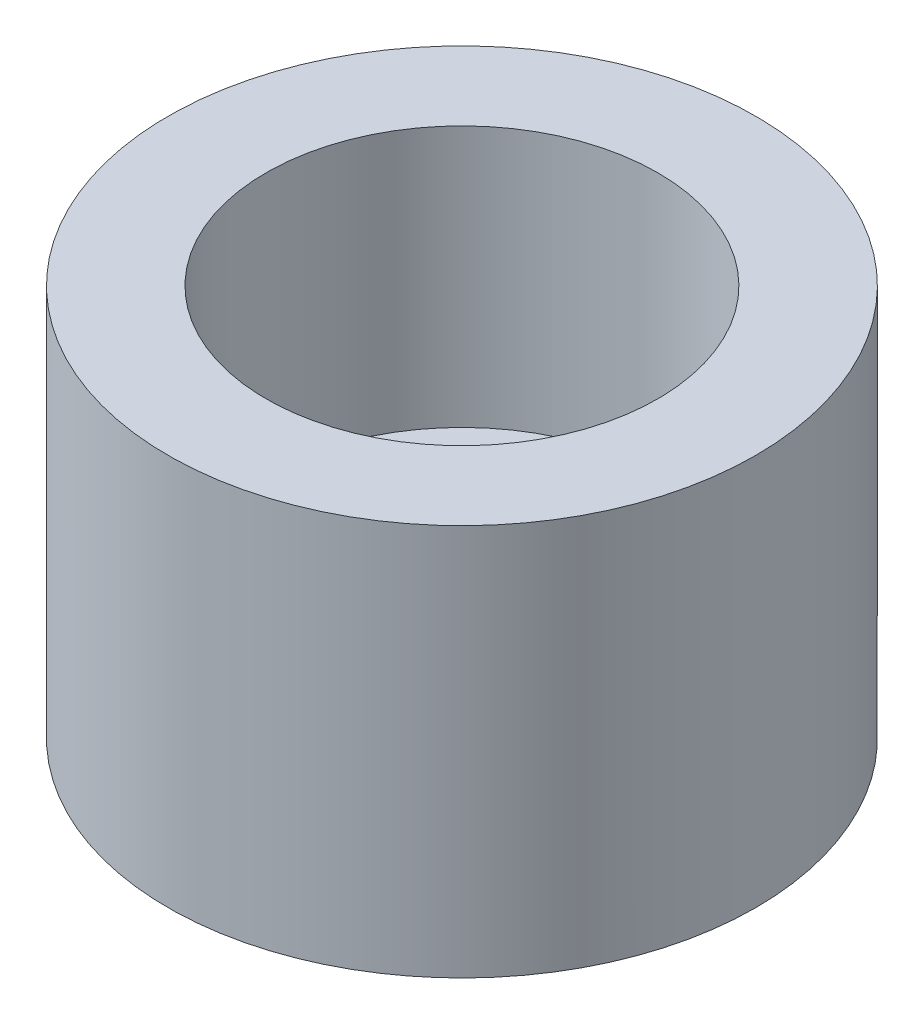
ISO-10303-21;
HEADER;
FILE_DESCRIPTION(('STEP AP214'),'2;1');
FILE_NAME('part.step','',(''),(''),'','','');
FILE_SCHEMA(('AUTOMOTIVE_DESIGN { 1 0 10303 214 1 1 1 1 }'));
ENDSEC;
DATA;
#1=APPLICATION_CONTEXT('core data for automotive mechanical design processes');
#2=APPLICATION_PROTOCOL_DEFINITION('international standard','automotive_design',2000,#1);
#3=PRODUCT_CONTEXT('',#1,'mechanical');
#4=PRODUCT('Part','Part','',(#3));
#5=PRODUCT_RELATED_PRODUCT_CATEGORY('part','',(#4));
#6=PRODUCT_DEFINITION_FORMATION('','',#4);
#7=PRODUCT_DEFINITION_CONTEXT('part definition',#1,'design');
#8=PRODUCT_DEFINITION('design','',#6,#7);
#9=PRODUCT_DEFINITION_SHAPE('','',#8);
#10=(LENGTH_UNIT() NAMED_UNIT(*) SI_UNIT(.MILLI.,.METRE.));
#11=(NAMED_UNIT(*) PLANE_ANGLE_UNIT() SI_UNIT($,.RADIAN.));
#12=(NAMED_UNIT(*) SI_UNIT($,.STERADIAN.) SOLID_ANGLE_UNIT());
#13=UNCERTAINTY_MEASURE_WITH_UNIT(LENGTH_MEASURE(1.E-05),#10,'distance_accuracy_value','');
#14=(GEOMETRIC_REPRESENTATION_CONTEXT(3) GLOBAL_UNCERTAINTY_ASSIGNED_CONTEXT((#13)) GLOBAL_UNIT_ASSIGNED_CONTEXT((#10,
#11,#12)) REPRESENTATION_CONTEXT('',''));
#15=CARTESIAN_POINT('',(0.,0.,0.));
#16=DIRECTION('',(0.,0.,1.));
#17=DIRECTION('',(1.,0.,0.));
#18=AXIS2_PLACEMENT_3D('',#15,#16,#17);
#19=CARTESIAN_POINT('',(0.,-20.4,-42.5));
#20=DIRECTION('',(0.,-1.,0.));
#21=DIRECTION('',(0.,0.,-1.));
#22=AXIS2_PLACEMENT_3D('',#19,#20,#21);
#23=PLANE('',#22);
#24=CARTESIAN_POINT('',(0.,-20.4,-42.5));
#25=DIRECTION('',(0.,-1.,0.));
#26=DIRECTION('',(1.,0.,0.));
#27=AXIS2_PLACEMENT_3D('',#24,#25,#26);
#28=CIRCLE('',#27,9.);
#29=CARTESIAN_POINT('',(9.00000000000001,-20.4,-42.5));
#30=VERTEX_POINT('',#29);
#31=EDGE_CURVE('E10',#30,#30,#28,.T.);
#32=ORIENTED_EDGE('',*,*,#31,.F.);
#33=EDGE_LOOP('',(#32));
#34=FACE_BOUND('',#33,.T.);
#35=CARTESIAN_POINT('',(0.,-20.4,-42.5));
#36=DIRECTION('',(0.,-1.,0.));
#37=DIRECTION('',(0.,0.,-1.));
#38=AXIS2_PLACEMENT_3D('',#35,#36,#37);
#39=CIRCLE('',#38,6.);
#40=CARTESIAN_POINT('',(0.,-20.4,-48.5));
#41=VERTEX_POINT('',#40);
#42=EDGE_CURVE('E37',#41,#41,#39,.T.);
#43=ORIENTED_EDGE('',*,*,#42,.T.);
#44=EDGE_LOOP('',(#43));
#45=FACE_BOUND('',#44,.T.);
#46=ADVANCED_FACE('F30',(#34,#45),#23,.F.);
#47=CARTESIAN_POINT('',(0.,-28.4,-42.5));
#48=DIRECTION('',(0.,1.,0.));
#49=DIRECTION('',(0.,0.,1.));
#50=AXIS2_PLACEMENT_3D('',#47,#48,#49);
#51=CYLINDRICAL_SURFACE('',#50,9.);
#52=ORIENTED_EDGE('',*,*,#31,.T.);
#53=EDGE_LOOP('',(#52));
#54=FACE_BOUND('',#53,.T.);
#55=CARTESIAN_POINT('',(0.,-32.4,-42.5));
#56=DIRECTION('',(0.,-1.,0.));
#57=DIRECTION('',(0.,0.,-1.));
#58=AXIS2_PLACEMENT_3D('',#55,#56,#57);
#59=CIRCLE('',#58,9.);
#60=CARTESIAN_POINT('',(0.,-32.4,-51.5));
#61=VERTEX_POINT('',#60);
#62=EDGE_CURVE('E45',#61,#61,#59,.T.);
#63=ORIENTED_EDGE('',*,*,#62,.F.);
#64=EDGE_LOOP('',(#63));
#65=FACE_BOUND('',#64,.T.);
#66=ADVANCED_FACE('F32',(#54,#65),#51,.T.);
#67=CARTESIAN_POINT('',(0.,-28.4,-42.5));
#68=DIRECTION('',(0.,1.,0.));
#69=DIRECTION('',(0.,0.,1.));
#70=AXIS2_PLACEMENT_3D('',#67,#68,#69);
#71=CYLINDRICAL_SURFACE('',#70,6.);
#72=CARTESIAN_POINT('',(0.,-28.4,-42.5));
#73=DIRECTION('',(0.,-1.,0.));
#74=DIRECTION('',(0.,0.,-1.));
#75=AXIS2_PLACEMENT_3D('',#72,#73,#74);
#76=CIRCLE('',#75,6.);
#77=CARTESIAN_POINT('',(0.,-28.4,-48.5));
#78=VERTEX_POINT('',#77);
#79=EDGE_CURVE('E41',#78,#78,#76,.T.);
#80=ORIENTED_EDGE('',*,*,#79,.T.);
#81=EDGE_LOOP('',(#80));
#82=FACE_BOUND('',#81,.T.);
#83=ORIENTED_EDGE('',*,*,#42,.F.);
#84=EDGE_LOOP('',(#83));
#85=FACE_BOUND('',#84,.T.);
#86=ADVANCED_FACE('F54',(#82,#85),#71,.F.);
#87=CARTESIAN_POINT('',(0.,-28.4,-42.5));
#88=DIRECTION('',(0.,-1.,0.));
#89=DIRECTION('',(0.,0.,-1.));
#90=AXIS2_PLACEMENT_3D('',#87,#88,#89);
#91=PLANE('',#90);
#92=ORIENTED_EDGE('',*,*,#79,.F.);
#93=EDGE_LOOP('',(#92));
#94=FACE_BOUND('',#93,.T.);
#95=ADVANCED_FACE('F59',(#94),#91,.F.);
#96=CARTESIAN_POINT('',(0.,-32.4,-42.5));
#97=DIRECTION('',(0.,-1.,0.));
#98=DIRECTION('',(0.,0.,-1.));
#99=AXIS2_PLACEMENT_3D('',#96,#97,#98);
#100=PLANE('',#99);
#101=ORIENTED_EDGE('',*,*,#62,.T.);
#102=EDGE_LOOP('',(#101));
#103=FACE_BOUND('',#102,.T.);
#104=ADVANCED_FACE('F51',(#103),#100,.T.);
#105=CLOSED_SHELL('',(#46,#66,#86,#95,#104));
#106=MANIFOLD_SOLID_BREP('B2',#105);
#107=ADVANCED_BREP_SHAPE_REPRESENTATION('',(#18,#106),#14);
#108=SHAPE_DEFINITION_REPRESENTATION(#9,#107);
ENDSEC;
END-ISO-10303-21;
